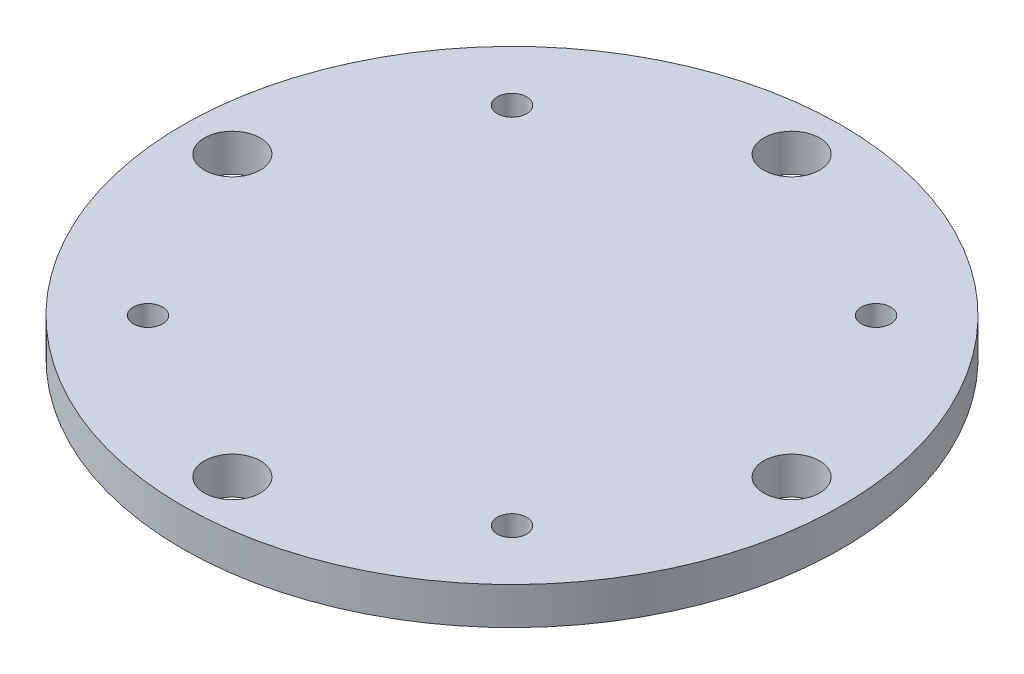
ISO-10303-21;
HEADER;
FILE_DESCRIPTION(('STEP AP214'),'2;1');
FILE_NAME('part.step','',(''),(''),'','','');
FILE_SCHEMA(('AUTOMOTIVE_DESIGN { 1 0 10303 214 1 1 1 1 }'));
ENDSEC;
DATA;
#1=APPLICATION_CONTEXT('core data for automotive mechanical design processes');
#2=APPLICATION_PROTOCOL_DEFINITION('international standard','automotive_design',2000,#1);
#3=PRODUCT_CONTEXT('',#1,'mechanical');
#4=PRODUCT('Part','Part','',(#3));
#5=PRODUCT_RELATED_PRODUCT_CATEGORY('part','',(#4));
#6=PRODUCT_DEFINITION_FORMATION('','',#4);
#7=PRODUCT_DEFINITION_CONTEXT('part definition',#1,'design');
#8=PRODUCT_DEFINITION('design','',#6,#7);
#9=PRODUCT_DEFINITION_SHAPE('','',#8);
#10=(LENGTH_UNIT() NAMED_UNIT(*) SI_UNIT(.MILLI.,.METRE.));
#11=(NAMED_UNIT(*) PLANE_ANGLE_UNIT() SI_UNIT($,.RADIAN.));
#12=(NAMED_UNIT(*) SI_UNIT($,.STERADIAN.) SOLID_ANGLE_UNIT());
#13=UNCERTAINTY_MEASURE_WITH_UNIT(LENGTH_MEASURE(1.E-05),#10,'distance_accuracy_value','');
#14=(GEOMETRIC_REPRESENTATION_CONTEXT(3) GLOBAL_UNCERTAINTY_ASSIGNED_CONTEXT((#13)) GLOBAL_UNIT_ASSIGNED_CONTEXT((#10,
#11,#12)) REPRESENTATION_CONTEXT('',''));
#15=CARTESIAN_POINT('',(0.,0.,0.));
#16=DIRECTION('',(0.,0.,1.));
#17=DIRECTION('',(1.,0.,0.));
#18=AXIS2_PLACEMENT_3D('',#15,#16,#17);
#19=CARTESIAN_POINT('',(0.,3.175,0.));
#20=DIRECTION('',(0.,-1.,0.));
#21=DIRECTION('',(0.,0.,-1.));
#22=AXIS2_PLACEMENT_3D('',#19,#20,#21);
#23=CYLINDRICAL_SURFACE('',#22,28.0633003783411);
#24=CARTESIAN_POINT('',(0.,3.175,0.));
#25=DIRECTION('',(0.,1.,0.));
#26=DIRECTION('',(0.,0.,1.));
#27=AXIS2_PLACEMENT_3D('',#24,#25,#26);
#28=CIRCLE('',#27,28.0633003783411);
#29=CARTESIAN_POINT('',(0.,3.175,28.0633003783411));
#30=VERTEX_POINT('',#29);
#31=EDGE_CURVE('E10',#30,#30,#28,.T.);
#32=ORIENTED_EDGE('',*,*,#31,.F.);
#33=EDGE_LOOP('',(#32));
#34=FACE_BOUND('',#33,.T.);
#35=CARTESIAN_POINT('',(0.,0.,0.));
#36=DIRECTION('',(0.,1.,0.));
#37=DIRECTION('',(0.,0.,1.));
#38=AXIS2_PLACEMENT_3D('',#35,#36,#37);
#39=CIRCLE('',#38,28.0633003783411);
#40=CARTESIAN_POINT('',(0.,0.,28.0633003783411));
#41=VERTEX_POINT('',#40);
#42=EDGE_CURVE('E37',#41,#41,#39,.T.);
#43=ORIENTED_EDGE('',*,*,#42,.T.);
#44=EDGE_LOOP('',(#43));
#45=FACE_BOUND('',#44,.T.);
#46=ADVANCED_FACE('F34',(#34,#45),#23,.T.);
#47=CARTESIAN_POINT('',(0.,3.175,0.));
#48=DIRECTION('',(0.,1.,0.));
#49=DIRECTION('',(0.,0.,1.));
#50=AXIS2_PLACEMENT_3D('',#47,#48,#49);
#51=PLANE('',#50);
#52=CARTESIAN_POINT('',(23.8125,3.175,-2.48701872897887E-13));
#53=DIRECTION('',(0.,1.,0.));
#54=DIRECTION('',(-1.,0.,0.));
#55=AXIS2_PLACEMENT_3D('',#52,#53,#54);
#56=CIRCLE('',#55,2.38125);
#57=CARTESIAN_POINT('',(21.43125,3.175,-2.23759603083526E-13));
#58=VERTEX_POINT('',#57);
#59=EDGE_CURVE('E88',#58,#58,#56,.T.);
#60=ORIENTED_EDGE('',*,*,#59,.F.);
#61=EDGE_LOOP('',(#60));
#62=FACE_BOUND('',#61,.T.);
#63=CARTESIAN_POINT('',(0.,3.175,23.8125));
#64=DIRECTION('',(0.,1.,0.));
#65=DIRECTION('',(0.,0.,-1.));
#66=AXIS2_PLACEMENT_3D('',#63,#64,#65);
#67=CIRCLE('',#66,2.38125);
#68=CARTESIAN_POINT('',(0.,3.175,21.43125));
#69=VERTEX_POINT('',#68);
#70=EDGE_CURVE('E82',#69,#69,#67,.T.);
#71=ORIENTED_EDGE('',*,*,#70,.F.);
#72=EDGE_LOOP('',(#71));
#73=FACE_BOUND('',#72,.T.);
#74=CARTESIAN_POINT('',(-23.8125,3.175,0.));
#75=DIRECTION('',(0.,1.,0.));
#76=DIRECTION('',(1.,0.,0.));
#77=AXIS2_PLACEMENT_3D('',#74,#75,#76);
#78=CIRCLE('',#77,2.38125);
#79=CARTESIAN_POINT('',(-21.43125,3.175,0.));
#80=VERTEX_POINT('',#79);
#81=EDGE_CURVE('E76',#80,#80,#78,.T.);
#82=ORIENTED_EDGE('',*,*,#81,.F.);
#83=EDGE_LOOP('',(#82));
#84=FACE_BOUND('',#83,.T.);
#85=CARTESIAN_POINT('',(0.,3.175,-23.8125));
#86=DIRECTION('',(0.,1.,0.));
#87=DIRECTION('',(0.,0.,1.));
#88=AXIS2_PLACEMENT_3D('',#85,#86,#87);
#89=CIRCLE('',#88,2.38125);
#90=CARTESIAN_POINT('',(0.,3.175,-21.43125));
#91=VERTEX_POINT('',#90);
#92=EDGE_CURVE('E70',#91,#91,#89,.T.);
#93=ORIENTED_EDGE('',*,*,#92,.F.);
#94=EDGE_LOOP('',(#93));
#95=FACE_BOUND('',#94,.T.);
#96=CARTESIAN_POINT('',(-15.5,3.175,-15.5));
#97=DIRECTION('',(0.,1.,0.));
#98=DIRECTION('',(0.,0.,1.));
#99=AXIS2_PLACEMENT_3D('',#96,#97,#98);
#100=CIRCLE('',#99,1.24999999999999);
#101=CARTESIAN_POINT('',(-15.5,3.175,-14.25));
#102=VERTEX_POINT('',#101);
#103=EDGE_CURVE('E66',#102,#102,#100,.T.);
#104=ORIENTED_EDGE('',*,*,#103,.F.);
#105=EDGE_LOOP('',(#104));
#106=FACE_BOUND('',#105,.T.);
#107=CARTESIAN_POINT('',(15.5,3.175,15.5));
#108=DIRECTION('',(0.,1.,0.));
#109=DIRECTION('',(0.,0.,1.));
#110=AXIS2_PLACEMENT_3D('',#107,#108,#109);
#111=CIRCLE('',#110,1.24999999999999);
#112=CARTESIAN_POINT('',(15.5,3.175,16.75));
#113=VERTEX_POINT('',#112);
#114=EDGE_CURVE('E60',#113,#113,#111,.T.);
#115=ORIENTED_EDGE('',*,*,#114,.F.);
#116=EDGE_LOOP('',(#115));
#117=FACE_BOUND('',#116,.T.);
#118=CARTESIAN_POINT('',(15.5,3.175,-15.5));
#119=DIRECTION('',(0.,1.,0.));
#120=DIRECTION('',(0.,0.,1.));
#121=AXIS2_PLACEMENT_3D('',#118,#119,#120);
#122=CIRCLE('',#121,1.24999999999999);
#123=CARTESIAN_POINT('',(15.5,3.175,-14.25));
#124=VERTEX_POINT('',#123);
#125=EDGE_CURVE('E54',#124,#124,#122,.T.);
#126=ORIENTED_EDGE('',*,*,#125,.F.);
#127=EDGE_LOOP('',(#126));
#128=FACE_BOUND('',#127,.T.);
#129=CARTESIAN_POINT('',(-15.5,3.175,15.5));
#130=DIRECTION('',(0.,1.,0.));
#131=DIRECTION('',(0.,0.,1.));
#132=AXIS2_PLACEMENT_3D('',#129,#130,#131);
#133=CIRCLE('',#132,1.24999999999999);
#134=CARTESIAN_POINT('',(-15.5,3.175,16.75));
#135=VERTEX_POINT('',#134);
#136=EDGE_CURVE('E48',#135,#135,#133,.T.);
#137=ORIENTED_EDGE('',*,*,#136,.F.);
#138=EDGE_LOOP('',(#137));
#139=FACE_BOUND('',#138,.T.);
#140=ORIENTED_EDGE('',*,*,#31,.T.);
#141=EDGE_LOOP('',(#140));
#142=FACE_BOUND('',#141,.T.);
#143=ADVANCED_FACE('F104',(#62,#73,#84,#95,#106,#117,#128,#139,#142),#51,.T.);
#144=CARTESIAN_POINT('',(0.,0.,0.));
#145=DIRECTION('',(0.,1.,0.));
#146=DIRECTION('',(0.,0.,1.));
#147=AXIS2_PLACEMENT_3D('',#144,#145,#146);
#148=PLANE('',#147);
#149=CARTESIAN_POINT('',(23.8125,0.,-2.48701872897887E-13));
#150=DIRECTION('',(0.,1.,0.));
#151=DIRECTION('',(-1.,0.,0.));
#152=AXIS2_PLACEMENT_3D('',#149,#150,#151);
#153=CIRCLE('',#152,2.38125);
#154=CARTESIAN_POINT('',(21.43125,0.,-2.23759603083526E-13));
#155=VERTEX_POINT('',#154);
#156=EDGE_CURVE('E85',#155,#155,#153,.T.);
#157=ORIENTED_EDGE('',*,*,#156,.T.);
#158=EDGE_LOOP('',(#157));
#159=FACE_BOUND('',#158,.T.);
#160=CARTESIAN_POINT('',(0.,0.,23.8125));
#161=DIRECTION('',(0.,1.,0.));
#162=DIRECTION('',(0.,0.,-1.));
#163=AXIS2_PLACEMENT_3D('',#160,#161,#162);
#164=CIRCLE('',#163,2.38125);
#165=CARTESIAN_POINT('',(0.,0.,21.43125));
#166=VERTEX_POINT('',#165);
#167=EDGE_CURVE('E79',#166,#166,#164,.T.);
#168=ORIENTED_EDGE('',*,*,#167,.T.);
#169=EDGE_LOOP('',(#168));
#170=FACE_BOUND('',#169,.T.);
#171=CARTESIAN_POINT('',(-23.8125,0.,0.));
#172=DIRECTION('',(0.,1.,0.));
#173=DIRECTION('',(1.,0.,0.));
#174=AXIS2_PLACEMENT_3D('',#171,#172,#173);
#175=CIRCLE('',#174,2.38125);
#176=CARTESIAN_POINT('',(-21.43125,0.,0.));
#177=VERTEX_POINT('',#176);
#178=EDGE_CURVE('E73',#177,#177,#175,.T.);
#179=ORIENTED_EDGE('',*,*,#178,.T.);
#180=EDGE_LOOP('',(#179));
#181=FACE_BOUND('',#180,.T.);
#182=CARTESIAN_POINT('',(0.,0.,-23.8125));
#183=DIRECTION('',(0.,1.,0.));
#184=DIRECTION('',(0.,0.,1.));
#185=AXIS2_PLACEMENT_3D('',#182,#183,#184);
#186=CIRCLE('',#185,2.38125);
#187=CARTESIAN_POINT('',(0.,0.,-21.43125));
#188=VERTEX_POINT('',#187);
#189=EDGE_CURVE('E69',#188,#188,#186,.T.);
#190=ORIENTED_EDGE('',*,*,#189,.T.);
#191=EDGE_LOOP('',(#190));
#192=FACE_BOUND('',#191,.T.);
#193=CARTESIAN_POINT('',(-15.5,0.,-15.5));
#194=DIRECTION('',(0.,1.,0.));
#195=DIRECTION('',(0.,0.,1.));
#196=AXIS2_PLACEMENT_3D('',#193,#194,#195);
#197=CIRCLE('',#196,1.24999999999999);
#198=CARTESIAN_POINT('',(-15.5,0.,-14.25));
#199=VERTEX_POINT('',#198);
#200=EDGE_CURVE('E63',#199,#199,#197,.T.);
#201=ORIENTED_EDGE('',*,*,#200,.T.);
#202=EDGE_LOOP('',(#201));
#203=FACE_BOUND('',#202,.T.);
#204=CARTESIAN_POINT('',(15.5,0.,15.5));
#205=DIRECTION('',(0.,1.,0.));
#206=DIRECTION('',(0.,0.,1.));
#207=AXIS2_PLACEMENT_3D('',#204,#205,#206);
#208=CIRCLE('',#207,1.24999999999999);
#209=CARTESIAN_POINT('',(15.5,0.,16.75));
#210=VERTEX_POINT('',#209);
#211=EDGE_CURVE('E57',#210,#210,#208,.T.);
#212=ORIENTED_EDGE('',*,*,#211,.T.);
#213=EDGE_LOOP('',(#212));
#214=FACE_BOUND('',#213,.T.);
#215=CARTESIAN_POINT('',(15.5,0.,-15.5));
#216=DIRECTION('',(0.,1.,0.));
#217=DIRECTION('',(0.,0.,1.));
#218=AXIS2_PLACEMENT_3D('',#215,#216,#217);
#219=CIRCLE('',#218,1.24999999999999);
#220=CARTESIAN_POINT('',(15.5,0.,-14.25));
#221=VERTEX_POINT('',#220);
#222=EDGE_CURVE('E51',#221,#221,#219,.T.);
#223=ORIENTED_EDGE('',*,*,#222,.T.);
#224=EDGE_LOOP('',(#223));
#225=FACE_BOUND('',#224,.T.);
#226=CARTESIAN_POINT('',(-15.5,0.,15.5));
#227=DIRECTION('',(0.,1.,0.));
#228=DIRECTION('',(0.,0.,1.));
#229=AXIS2_PLACEMENT_3D('',#226,#227,#228);
#230=CIRCLE('',#229,1.24999999999999);
#231=CARTESIAN_POINT('',(-15.5,0.,16.75));
#232=VERTEX_POINT('',#231);
#233=EDGE_CURVE('E44',#232,#232,#230,.T.);
#234=ORIENTED_EDGE('',*,*,#233,.T.);
#235=EDGE_LOOP('',(#234));
#236=FACE_BOUND('',#235,.T.);
#237=ORIENTED_EDGE('',*,*,#42,.F.);
#238=EDGE_LOOP('',(#237));
#239=FACE_BOUND('',#238,.T.);
#240=ADVANCED_FACE('F94',(#159,#170,#181,#192,#203,#214,#225,#236,#239),#148,.F.);
#241=CARTESIAN_POINT('',(-15.5,3.175,15.5));
#242=DIRECTION('',(0.,1.,0.));
#243=DIRECTION('',(0.,0.,1.));
#244=AXIS2_PLACEMENT_3D('',#241,#242,#243);
#245=CYLINDRICAL_SURFACE('',#244,1.24999999999999);
#246=ORIENTED_EDGE('',*,*,#136,.T.);
#247=EDGE_LOOP('',(#246));
#248=FACE_BOUND('',#247,.T.);
#249=ORIENTED_EDGE('',*,*,#233,.F.);
#250=EDGE_LOOP('',(#249));
#251=FACE_BOUND('',#250,.T.);
#252=ADVANCED_FACE('F122',(#248,#251),#245,.F.);
#253=CARTESIAN_POINT('',(15.5,3.175,-15.5));
#254=DIRECTION('',(0.,1.,0.));
#255=DIRECTION('',(0.,0.,1.));
#256=AXIS2_PLACEMENT_3D('',#253,#254,#255);
#257=CYLINDRICAL_SURFACE('',#256,1.24999999999999);
#258=ORIENTED_EDGE('',*,*,#125,.T.);
#259=EDGE_LOOP('',(#258));
#260=FACE_BOUND('',#259,.T.);
#261=ORIENTED_EDGE('',*,*,#222,.F.);
#262=EDGE_LOOP('',(#261));
#263=FACE_BOUND('',#262,.T.);
#264=ADVANCED_FACE('F125',(#260,#263),#257,.F.);
#265=CARTESIAN_POINT('',(15.5,3.175,15.5));
#266=DIRECTION('',(0.,1.,0.));
#267=DIRECTION('',(0.,0.,1.));
#268=AXIS2_PLACEMENT_3D('',#265,#266,#267);
#269=CYLINDRICAL_SURFACE('',#268,1.24999999999999);
#270=ORIENTED_EDGE('',*,*,#114,.T.);
#271=EDGE_LOOP('',(#270));
#272=FACE_BOUND('',#271,.T.);
#273=ORIENTED_EDGE('',*,*,#211,.F.);
#274=EDGE_LOOP('',(#273));
#275=FACE_BOUND('',#274,.T.);
#276=ADVANCED_FACE('F157',(#272,#275),#269,.F.);
#277=CARTESIAN_POINT('',(-15.5,3.175,-15.5));
#278=DIRECTION('',(0.,1.,0.));
#279=DIRECTION('',(0.,0.,1.));
#280=AXIS2_PLACEMENT_3D('',#277,#278,#279);
#281=CYLINDRICAL_SURFACE('',#280,1.24999999999999);
#282=ORIENTED_EDGE('',*,*,#103,.T.);
#283=EDGE_LOOP('',(#282));
#284=FACE_BOUND('',#283,.T.);
#285=ORIENTED_EDGE('',*,*,#200,.F.);
#286=EDGE_LOOP('',(#285));
#287=FACE_BOUND('',#286,.T.);
#288=ADVANCED_FACE('F165',(#284,#287),#281,.F.);
#289=CARTESIAN_POINT('',(0.,0.,-23.8125));
#290=DIRECTION('',(0.,1.,0.));
#291=DIRECTION('',(0.,0.,1.));
#292=AXIS2_PLACEMENT_3D('',#289,#290,#291);
#293=CYLINDRICAL_SURFACE('',#292,2.38125);
#294=ORIENTED_EDGE('',*,*,#189,.F.);
#295=EDGE_LOOP('',(#294));
#296=FACE_BOUND('',#295,.T.);
#297=ORIENTED_EDGE('',*,*,#92,.T.);
#298=EDGE_LOOP('',(#297));
#299=FACE_BOUND('',#298,.T.);
#300=ADVANCED_FACE('F173',(#296,#299),#293,.F.);
#301=CARTESIAN_POINT('',(-23.8125,0.,0.));
#302=DIRECTION('',(0.,1.,0.));
#303=DIRECTION('',(0.,0.,1.));
#304=AXIS2_PLACEMENT_3D('',#301,#302,#303);
#305=CYLINDRICAL_SURFACE('',#304,2.38125);
#306=ORIENTED_EDGE('',*,*,#178,.F.);
#307=EDGE_LOOP('',(#306));
#308=FACE_BOUND('',#307,.T.);
#309=ORIENTED_EDGE('',*,*,#81,.T.);
#310=EDGE_LOOP('',(#309));
#311=FACE_BOUND('',#310,.T.);
#312=ADVANCED_FACE('F180',(#308,#311),#305,.F.);
#313=CARTESIAN_POINT('',(0.,0.,23.8125));
#314=DIRECTION('',(0.,1.,0.));
#315=DIRECTION('',(0.,0.,1.));
#316=AXIS2_PLACEMENT_3D('',#313,#314,#315);
#317=CYLINDRICAL_SURFACE('',#316,2.38125);
#318=ORIENTED_EDGE('',*,*,#167,.F.);
#319=EDGE_LOOP('',(#318));
#320=FACE_BOUND('',#319,.T.);
#321=ORIENTED_EDGE('',*,*,#70,.T.);
#322=EDGE_LOOP('',(#321));
#323=FACE_BOUND('',#322,.T.);
#324=ADVANCED_FACE('F100',(#320,#323),#317,.F.);
#325=CARTESIAN_POINT('',(23.8125,0.,-2.48701872897887E-13));
#326=DIRECTION('',(0.,1.,0.));
#327=DIRECTION('',(0.,0.,1.));
#328=AXIS2_PLACEMENT_3D('',#325,#326,#327);
#329=CYLINDRICAL_SURFACE('',#328,2.38125);
#330=ORIENTED_EDGE('',*,*,#156,.F.);
#331=EDGE_LOOP('',(#330));
#332=FACE_BOUND('',#331,.T.);
#333=ORIENTED_EDGE('',*,*,#59,.T.);
#334=EDGE_LOOP('',(#333));
#335=FACE_BOUND('',#334,.T.);
#336=ADVANCED_FACE('F97',(#332,#335),#329,.F.);
#337=CLOSED_SHELL('',(#46,#143,#240,#252,#264,#276,#288,#300,#312,#324,#336));
#338=MANIFOLD_SOLID_BREP('B2',#337);
#339=ADVANCED_BREP_SHAPE_REPRESENTATION('',(#18,#338),#14);
#340=SHAPE_DEFINITION_REPRESENTATION(#9,#339);
ENDSEC;
END-ISO-10303-21;
